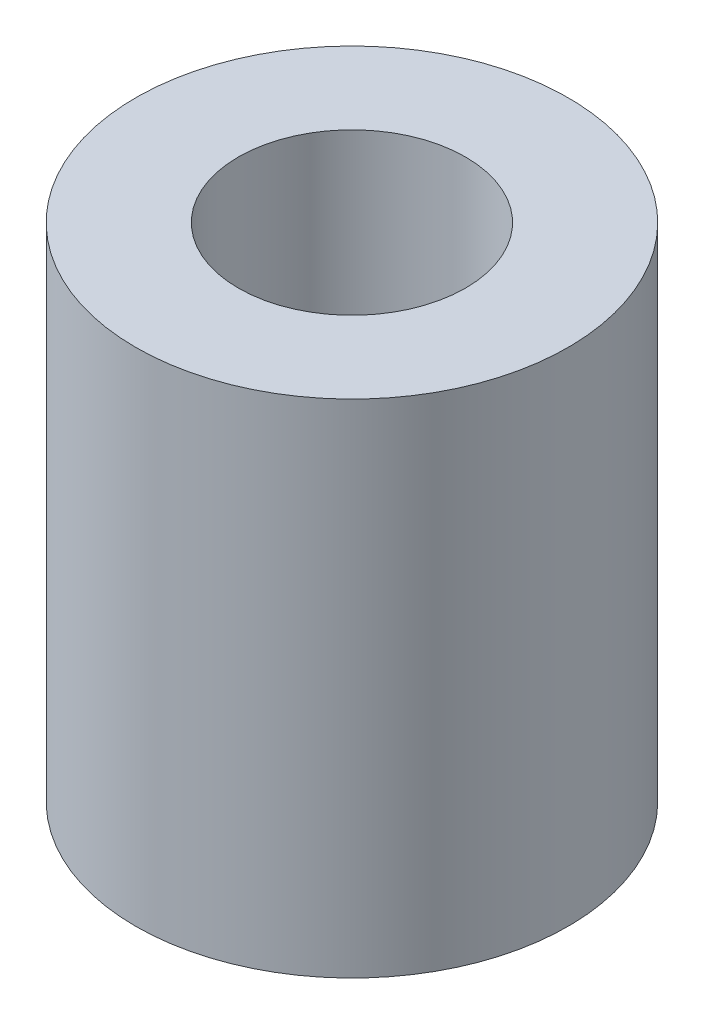
ISO-10303-21;
HEADER;
FILE_DESCRIPTION(('STEP AP214'),'2;1');
FILE_NAME('part.step','',(''),(''),'','','');
FILE_SCHEMA(('AUTOMOTIVE_DESIGN { 1 0 10303 214 1 1 1 1 }'));
ENDSEC;
DATA;
#1=APPLICATION_CONTEXT('core data for automotive mechanical design processes');
#2=APPLICATION_PROTOCOL_DEFINITION('international standard','automotive_design',2000,#1);
#3=PRODUCT_CONTEXT('',#1,'mechanical');
#4=PRODUCT('Part','Part','',(#3));
#5=PRODUCT_RELATED_PRODUCT_CATEGORY('part','',(#4));
#6=PRODUCT_DEFINITION_FORMATION('','',#4);
#7=PRODUCT_DEFINITION_CONTEXT('part definition',#1,'design');
#8=PRODUCT_DEFINITION('design','',#6,#7);
#9=PRODUCT_DEFINITION_SHAPE('','',#8);
#10=(LENGTH_UNIT() NAMED_UNIT(*) SI_UNIT(.MILLI.,.METRE.));
#11=(NAMED_UNIT(*) PLANE_ANGLE_UNIT() SI_UNIT($,.RADIAN.));
#12=(NAMED_UNIT(*) SI_UNIT($,.STERADIAN.) SOLID_ANGLE_UNIT());
#13=UNCERTAINTY_MEASURE_WITH_UNIT(LENGTH_MEASURE(1.E-05),#10,'distance_accuracy_value','');
#14=(GEOMETRIC_REPRESENTATION_CONTEXT(3) GLOBAL_UNCERTAINTY_ASSIGNED_CONTEXT((#13)) GLOBAL_UNIT_ASSIGNED_CONTEXT((#10,
#11,#12)) REPRESENTATION_CONTEXT('',''));
#15=CARTESIAN_POINT('',(0.,0.,0.));
#16=DIRECTION('',(0.,0.,1.));
#17=DIRECTION('',(1.,0.,0.));
#18=AXIS2_PLACEMENT_3D('',#15,#16,#17);
#19=CARTESIAN_POINT('',(0.,16.,0.));
#20=DIRECTION('',(0.,-1.,0.));
#21=DIRECTION('',(0.,0.,-1.));
#22=AXIS2_PLACEMENT_3D('',#19,#20,#21);
#23=CYLINDRICAL_SURFACE('',#22,6.9);
#24=CARTESIAN_POINT('',(0.,16.,0.));
#25=DIRECTION('',(0.,1.,0.));
#26=DIRECTION('',(0.,0.,1.));
#27=AXIS2_PLACEMENT_3D('',#24,#25,#26);
#28=CIRCLE('',#27,6.9);
#29=CARTESIAN_POINT('',(0.,16.,6.9));
#30=VERTEX_POINT('',#29);
#31=EDGE_CURVE('E11',#30,#30,#28,.T.);
#32=ORIENTED_EDGE('',*,*,#31,.F.);
#33=EDGE_LOOP('',(#32));
#34=FACE_BOUND('',#33,.T.);
#35=CARTESIAN_POINT('',(0.,0.,0.));
#36=DIRECTION('',(0.,1.,0.));
#37=DIRECTION('',(0.,0.,1.));
#38=AXIS2_PLACEMENT_3D('',#35,#36,#37);
#39=CIRCLE('',#38,6.9);
#40=CARTESIAN_POINT('',(0.,0.,6.9));
#41=VERTEX_POINT('',#40);
#42=EDGE_CURVE('E38',#41,#41,#39,.T.);
#43=ORIENTED_EDGE('',*,*,#42,.T.);
#44=EDGE_LOOP('',(#43));
#45=FACE_BOUND('',#44,.T.);
#46=ADVANCED_FACE('F35',(#34,#45),#23,.T.);
#47=CARTESIAN_POINT('',(0.,16.,0.));
#48=DIRECTION('',(0.,1.,0.));
#49=DIRECTION('',(0.,0.,1.));
#50=AXIS2_PLACEMENT_3D('',#47,#48,#49);
#51=PLANE('',#50);
#52=CARTESIAN_POINT('',(0.,16.,0.));
#53=DIRECTION('',(0.,1.,0.));
#54=DIRECTION('',(0.,0.,1.));
#55=AXIS2_PLACEMENT_3D('',#52,#53,#54);
#56=CIRCLE('',#55,3.625);
#57=CARTESIAN_POINT('',(0.,16.,3.625));
#58=VERTEX_POINT('',#57);
#59=EDGE_CURVE('E49',#58,#58,#56,.T.);
#60=ORIENTED_EDGE('',*,*,#59,.F.);
#61=EDGE_LOOP('',(#60));
#62=FACE_BOUND('',#61,.T.);
#63=ORIENTED_EDGE('',*,*,#31,.T.);
#64=EDGE_LOOP('',(#63));
#65=FACE_BOUND('',#64,.T.);
#66=ADVANCED_FACE('F55',(#62,#65),#51,.T.);
#67=CARTESIAN_POINT('',(0.,0.,0.));
#68=DIRECTION('',(0.,1.,0.));
#69=DIRECTION('',(0.,0.,1.));
#70=AXIS2_PLACEMENT_3D('',#67,#68,#69);
#71=PLANE('',#70);
#72=ORIENTED_EDGE('',*,*,#42,.F.);
#73=EDGE_LOOP('',(#72));
#74=FACE_BOUND('',#73,.T.);
#75=ADVANCED_FACE('F57',(#74),#71,.F.);
#76=CARTESIAN_POINT('',(0.,-10.2530483272049,0.));
#77=DIRECTION('',(0.,1.,0.));
#78=DIRECTION('',(0.,0.,1.));
#79=AXIS2_PLACEMENT_3D('',#76,#77,#78);
#80=CYLINDRICAL_SURFACE('',#79,3.625);
#81=CARTESIAN_POINT('',(0.,2.,0.));
#82=DIRECTION('',(0.,1.,0.));
#83=DIRECTION('',(0.,0.,1.));
#84=AXIS2_PLACEMENT_3D('',#81,#82,#83);
#85=CIRCLE('',#84,3.625);
#86=CARTESIAN_POINT('',(0.,2.,3.625));
#87=VERTEX_POINT('',#86);
#88=EDGE_CURVE('E45',#87,#87,#85,.F.);
#89=ORIENTED_EDGE('',*,*,#88,.T.);
#90=EDGE_LOOP('',(#89));
#91=FACE_BOUND('',#90,.T.);
#92=ORIENTED_EDGE('',*,*,#59,.T.);
#93=EDGE_LOOP('',(#92));
#94=FACE_BOUND('',#93,.T.);
#95=ADVANCED_FACE('F53',(#91,#94),#80,.F.);
#96=CARTESIAN_POINT('',(0.,2.,0.));
#97=DIRECTION('',(0.,1.,0.));
#98=DIRECTION('',(0.,0.,1.));
#99=AXIS2_PLACEMENT_3D('',#96,#97,#98);
#100=PLANE('',#99);
#101=ORIENTED_EDGE('',*,*,#88,.F.);
#102=EDGE_LOOP('',(#101));
#103=FACE_BOUND('',#102,.T.);
#104=ADVANCED_FACE('F68',(#103),#100,.T.);
#105=CLOSED_SHELL('',(#46,#66,#75,#95,#104));
#106=MANIFOLD_SOLID_BREP('B2',#105);
#107=ADVANCED_BREP_SHAPE_REPRESENTATION('',(#18,#106),#14);
#108=SHAPE_DEFINITION_REPRESENTATION(#9,#107);
ENDSEC;
END-ISO-10303-21;
